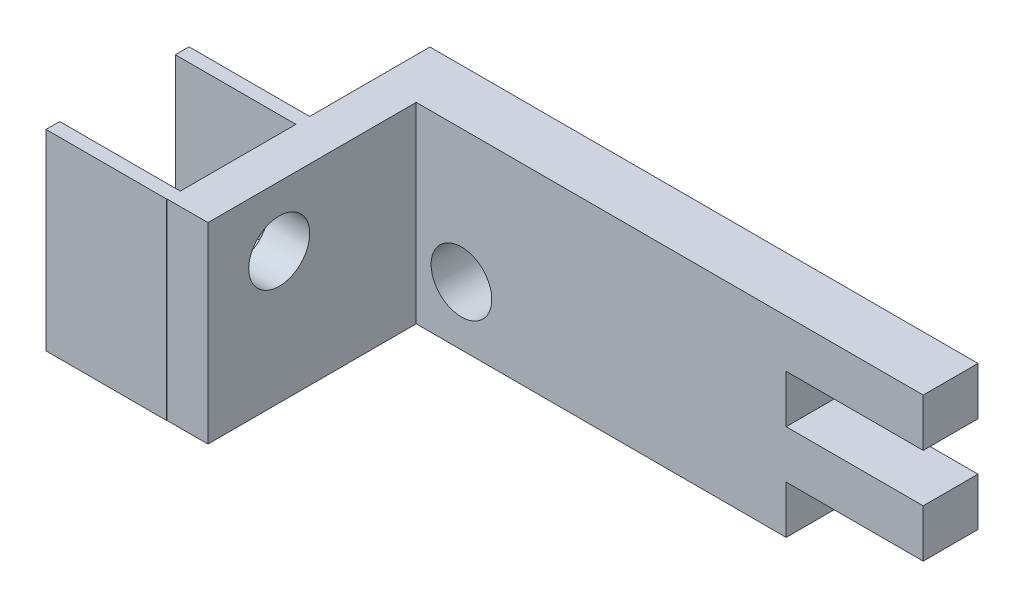
ISO-10303-21;
HEADER;
FILE_DESCRIPTION(('STEP AP214'),'2;1');
FILE_NAME('part.step','',(''),(''),'','','');
FILE_SCHEMA(('AUTOMOTIVE_DESIGN { 1 0 10303 214 1 1 1 1 }'));
ENDSEC;
DATA;
#1=APPLICATION_CONTEXT('core data for automotive mechanical design processes');
#2=APPLICATION_PROTOCOL_DEFINITION('international standard','automotive_design',2000,#1);
#3=PRODUCT_CONTEXT('',#1,'mechanical');
#4=PRODUCT('Part','Part','',(#3));
#5=PRODUCT_RELATED_PRODUCT_CATEGORY('part','',(#4));
#6=PRODUCT_DEFINITION_FORMATION('','',#4);
#7=PRODUCT_DEFINITION_CONTEXT('part definition',#1,'design');
#8=PRODUCT_DEFINITION('design','',#6,#7);
#9=PRODUCT_DEFINITION_SHAPE('','',#8);
#10=(LENGTH_UNIT() NAMED_UNIT(*) SI_UNIT(.MILLI.,.METRE.));
#11=(NAMED_UNIT(*) PLANE_ANGLE_UNIT() SI_UNIT($,.RADIAN.));
#12=(NAMED_UNIT(*) SI_UNIT($,.STERADIAN.) SOLID_ANGLE_UNIT());
#13=UNCERTAINTY_MEASURE_WITH_UNIT(LENGTH_MEASURE(1.E-05),#10,'distance_accuracy_value','');
#14=(GEOMETRIC_REPRESENTATION_CONTEXT(3) GLOBAL_UNCERTAINTY_ASSIGNED_CONTEXT((#13)) GLOBAL_UNIT_ASSIGNED_CONTEXT((#10,
#11,#12)) REPRESENTATION_CONTEXT('',''));
#15=CARTESIAN_POINT('',(0.,0.,0.));
#16=DIRECTION('',(0.,0.,1.));
#17=DIRECTION('',(1.,0.,0.));
#18=AXIS2_PLACEMENT_3D('',#15,#16,#17);
#19=CARTESIAN_POINT('',(-175.,70.,-45.));
#20=DIRECTION('',(1.,0.,0.));
#21=DIRECTION('',(0.,0.,-1.));
#22=AXIS2_PLACEMENT_3D('',#19,#20,#21);
#23=PLANE('',#22);
#24=DIRECTION('',(0.,-1.,0.));
#25=VECTOR('',#24,1.);
#26=CARTESIAN_POINT('',(-175.,0.,-1.10000000000001));
#27=LINE('',#26,#25);
#28=CARTESIAN_POINT('',(-175.,70.,-1.10000000000002));
#29=VERTEX_POINT('',#28);
#30=CARTESIAN_POINT('',(-175.,0.,-1.10000000000002));
#31=VERTEX_POINT('',#30);
#32=EDGE_CURVE('E225',#29,#31,#27,.T.);
#33=ORIENTED_EDGE('',*,*,#32,.F.);
#34=DIRECTION('',(0.,0.,1.));
#35=VECTOR('',#34,1.);
#36=CARTESIAN_POINT('',(-175.,70.,-45.));
#37=LINE('',#36,#35);
#38=CARTESIAN_POINT('',(-175.,70.,-45.));
#39=VERTEX_POINT('',#38);
#40=EDGE_CURVE('E353',#39,#29,#37,.T.);
#41=ORIENTED_EDGE('',*,*,#40,.F.);
#42=DIRECTION('',(0.,-1.,0.));
#43=VECTOR('',#42,1.);
#44=CARTESIAN_POINT('',(-175.,70.,-45.));
#45=LINE('',#44,#43);
#46=CARTESIAN_POINT('',(-175.,0.,-45.));
#47=VERTEX_POINT('',#46);
#48=EDGE_CURVE('E357',#39,#47,#45,.T.);
#49=ORIENTED_EDGE('',*,*,#48,.T.);
#50=DIRECTION('',(0.,0.,1.));
#51=VECTOR('',#50,1.);
#52=CARTESIAN_POINT('',(-175.,0.,-45.));
#53=LINE('',#52,#51);
#54=EDGE_CURVE('E352',#47,#31,#53,.T.);
#55=ORIENTED_EDGE('',*,*,#54,.T.);
#56=EDGE_LOOP('',(#33,#41,#49,#55));
#57=FACE_BOUND('',#56,.T.);
#58=ADVANCED_FACE('F61',(#57),#23,.F.);
#59=CARTESIAN_POINT('',(-175.,48.,25.));
#60=DIRECTION('',(-1.,0.,0.));
#61=DIRECTION('',(0.,0.,1.));
#62=AXIS2_PLACEMENT_3D('',#59,#60,#61);
#63=CIRCLE('',#62,11.125);
#64=CARTESIAN_POINT('',(-175.,48.,36.125));
#65=VERTEX_POINT('',#64);
#66=EDGE_CURVE('E325',#65,#65,#63,.T.);
#67=ORIENTED_EDGE('',*,*,#66,.F.);
#68=EDGE_LOOP('',(#67));
#69=FACE_BOUND('',#68,.T.);
#70=DIRECTION('',(0.,1.,0.));
#71=VECTOR('',#70,1.);
#72=CARTESIAN_POINT('',(-175.,70.,3.89999999999999));
#73=LINE('',#72,#71);
#74=CARTESIAN_POINT('',(-175.,26.75,3.89999999999999));
#75=VERTEX_POINT('',#74);
#76=CARTESIAN_POINT('',(-175.,70.,3.89999999999997));
#77=VERTEX_POINT('',#76);
#78=EDGE_CURVE('E232',#75,#77,#73,.T.);
#79=ORIENTED_EDGE('',*,*,#78,.F.);
#80=DIRECTION('',(0.,0.,-1.));
#81=VECTOR('',#80,1.);
#82=CARTESIAN_POINT('',(-175.,26.75,46.1));
#83=LINE('',#82,#81);
#84=CARTESIAN_POINT('',(-175.,26.75,46.1));
#85=VERTEX_POINT('',#84);
#86=EDGE_CURVE('E12',#85,#75,#83,.T.);
#87=ORIENTED_EDGE('',*,*,#86,.F.);
#88=DIRECTION('',(0.,-1.,0.));
#89=VECTOR('',#88,1.);
#90=CARTESIAN_POINT('',(-175.,70.,46.1));
#91=LINE('',#90,#89);
#92=CARTESIAN_POINT('',(-175.,70.,46.1));
#93=VERTEX_POINT('',#92);
#94=EDGE_CURVE('E435',#93,#85,#91,.T.);
#95=ORIENTED_EDGE('',*,*,#94,.F.);
#96=EDGE_CURVE('E86',#77,#93,#37,.T.);
#97=ORIENTED_EDGE('',*,*,#96,.F.);
#98=EDGE_LOOP('',(#79,#87,#95,#97));
#99=FACE_BOUND('',#98,.T.);
#100=ADVANCED_FACE('F474',(#69,#99),#23,.F.);
#101=CARTESIAN_POINT('',(-175.,70.,-45.));
#102=DIRECTION('',(0.,0.,1.));
#103=DIRECTION('',(1.,0.,0.));
#104=AXIS2_PLACEMENT_3D('',#101,#102,#103);
#105=PLANE('',#104);
#106=CARTESIAN_POINT('',(-143.5,21.5,-45.));
#107=DIRECTION('',(0.,0.,1.));
#108=DIRECTION('',(1.,0.,0.));
#109=AXIS2_PLACEMENT_3D('',#106,#107,#108);
#110=CIRCLE('',#109,11.075);
#111=CARTESIAN_POINT('',(-154.575,21.5,-45.));
#112=VERTEX_POINT('',#111);
#113=EDGE_CURVE('E299',#112,#112,#110,.T.);
#114=ORIENTED_EDGE('',*,*,#113,.T.);
#115=EDGE_LOOP('',(#114));
#116=FACE_BOUND('',#115,.T.);
#117=DIRECTION('',(1.,0.,0.));
#118=VECTOR('',#117,1.);
#119=CARTESIAN_POINT('',(0.,17.5,-45.));
#120=LINE('',#119,#118);
#121=CARTESIAN_POINT('',(-25.,17.5,-45.));
#122=VERTEX_POINT('',#121);
#123=CARTESIAN_POINT('',(25.,17.5,-45.));
#124=VERTEX_POINT('',#123);
#125=EDGE_CURVE('E279',#122,#124,#120,.T.);
#126=ORIENTED_EDGE('',*,*,#125,.F.);
#127=DIRECTION('',(0.,1.,0.));
#128=VECTOR('',#127,1.);
#129=CARTESIAN_POINT('',(-25.,0.,-45.));
#130=LINE('',#129,#128);
#131=CARTESIAN_POINT('',(-25.,0.,-45.));
#132=VERTEX_POINT('',#131);
#133=EDGE_CURVE('E275',#132,#122,#130,.T.);
#134=ORIENTED_EDGE('',*,*,#133,.F.);
#135=DIRECTION('',(-1.,0.,0.));
#136=VECTOR('',#135,1.);
#137=CARTESIAN_POINT('',(-175.,0.,-45.));
#138=LINE('',#137,#136);
#139=EDGE_CURVE('E348',#132,#47,#138,.T.);
#140=ORIENTED_EDGE('',*,*,#139,.T.);
#141=ORIENTED_EDGE('',*,*,#48,.F.);
#142=DIRECTION('',(-1.,0.,0.));
#143=VECTOR('',#142,1.);
#144=CARTESIAN_POINT('',(-175.,70.,-45.));
#145=LINE('',#144,#143);
#146=CARTESIAN_POINT('',(25.,70.,-45.));
#147=VERTEX_POINT('',#146);
#148=EDGE_CURVE('E349',#147,#39,#145,.T.);
#149=ORIENTED_EDGE('',*,*,#148,.F.);
#150=DIRECTION('',(0.,1.,0.));
#151=VECTOR('',#150,1.);
#152=CARTESIAN_POINT('',(25.,0.,-45.));
#153=LINE('',#152,#151);
#154=CARTESIAN_POINT('',(25.,52.5,-45.));
#155=VERTEX_POINT('',#154);
#156=EDGE_CURVE('E272',#155,#147,#153,.T.);
#157=ORIENTED_EDGE('',*,*,#156,.F.);
#158=DIRECTION('',(1.,0.,0.));
#159=VECTOR('',#158,1.);
#160=CARTESIAN_POINT('',(0.,52.5,-45.));
#161=LINE('',#160,#159);
#162=CARTESIAN_POINT('',(-25.,52.5,-45.));
#163=VERTEX_POINT('',#162);
#164=EDGE_CURVE('E268',#163,#155,#161,.T.);
#165=ORIENTED_EDGE('',*,*,#164,.F.);
#166=DIRECTION('',(0.,1.,0.));
#167=VECTOR('',#166,1.);
#168=CARTESIAN_POINT('',(-25.,0.,-45.));
#169=LINE('',#168,#167);
#170=CARTESIAN_POINT('',(-25.,35.,-45.));
#171=VERTEX_POINT('',#170);
#172=EDGE_CURVE('E291',#171,#163,#169,.T.);
#173=ORIENTED_EDGE('',*,*,#172,.F.);
#174=DIRECTION('',(-1.,0.,0.));
#175=VECTOR('',#174,1.);
#176=CARTESIAN_POINT('',(0.,35.,-45.));
#177=LINE('',#176,#175);
#178=CARTESIAN_POINT('',(25.,35.,-45.));
#179=VERTEX_POINT('',#178);
#180=EDGE_CURVE('E287',#179,#171,#177,.T.);
#181=ORIENTED_EDGE('',*,*,#180,.F.);
#182=DIRECTION('',(0.,1.,0.));
#183=VECTOR('',#182,1.);
#184=CARTESIAN_POINT('',(25.,0.,-45.));
#185=LINE('',#184,#183);
#186=EDGE_CURVE('E283',#124,#179,#185,.T.);
#187=ORIENTED_EDGE('',*,*,#186,.F.);
#188=EDGE_LOOP('',(#126,#134,#140,#141,#149,#157,#165,#173,#181,#187));
#189=FACE_BOUND('',#188,.T.);
#190=ADVANCED_FACE('F63',(#116,#189),#105,.F.);
#191=CARTESIAN_POINT('',(0.,70.,0.));
#192=DIRECTION('',(0.,1.,0.));
#193=DIRECTION('',(0.,0.,1.));
#194=AXIS2_PLACEMENT_3D('',#191,#192,#193);
#195=PLANE('',#194);
#196=DIRECTION('',(0.,0.,-1.));
#197=VECTOR('',#196,1.);
#198=CARTESIAN_POINT('',(25.,70.,45.));
#199=LINE('',#198,#197);
#200=CARTESIAN_POINT('',(25.,70.,-25.));
#201=VERTEX_POINT('',#200);
#202=EDGE_CURVE('E315',#201,#147,#199,.T.);
#203=ORIENTED_EDGE('',*,*,#202,.T.);
#204=ORIENTED_EDGE('',*,*,#148,.T.);
#205=ORIENTED_EDGE('',*,*,#40,.T.);
#206=DIRECTION('',(1.,0.,0.));
#207=VECTOR('',#206,1.);
#208=CARTESIAN_POINT('',(-219.,70.,-1.10000000000001));
#209=LINE('',#208,#207);
#210=CARTESIAN_POINT('',(-219.,70.,-1.10000000000001));
#211=VERTEX_POINT('',#210);
#212=EDGE_CURVE('E244',#211,#29,#209,.T.);
#213=ORIENTED_EDGE('',*,*,#212,.F.);
#214=DIRECTION('',(0.,0.,-1.));
#215=VECTOR('',#214,1.);
#216=CARTESIAN_POINT('',(-219.,70.,-1.10000000000001));
#217=LINE('',#216,#215);
#218=CARTESIAN_POINT('',(-219.,70.,3.89999999999999));
#219=VERTEX_POINT('',#218);
#220=EDGE_CURVE('E421',#219,#211,#217,.T.);
#221=ORIENTED_EDGE('',*,*,#220,.F.);
#222=DIRECTION('',(1.,0.,0.));
#223=VECTOR('',#222,1.);
#224=CARTESIAN_POINT('',(-219.,70.,3.89999999999999));
#225=LINE('',#224,#223);
#226=EDGE_CURVE('E248',#219,#77,#225,.T.);
#227=ORIENTED_EDGE('',*,*,#226,.T.);
#228=ORIENTED_EDGE('',*,*,#96,.T.);
#229=DIRECTION('',(1.,0.,0.));
#230=VECTOR('',#229,1.);
#231=CARTESIAN_POINT('',(-219.,70.,46.1));
#232=LINE('',#231,#230);
#233=CARTESIAN_POINT('',(-219.,70.,46.1));
#234=VERTEX_POINT('',#233);
#235=EDGE_CURVE('E260',#234,#93,#232,.T.);
#236=ORIENTED_EDGE('',*,*,#235,.F.);
#237=DIRECTION('',(0.,0.,-1.));
#238=VECTOR('',#237,1.);
#239=CARTESIAN_POINT('',(-219.,70.,51.1));
#240=LINE('',#239,#238);
#241=CARTESIAN_POINT('',(-219.,70.,51.1));
#242=VERTEX_POINT('',#241);
#243=EDGE_CURVE('E229',#242,#234,#240,.T.);
#244=ORIENTED_EDGE('',*,*,#243,.F.);
#245=DIRECTION('',(1.,0.,0.));
#246=VECTOR('',#245,1.);
#247=CARTESIAN_POINT('',(-219.,70.,51.1));
#248=LINE('',#247,#246);
#249=CARTESIAN_POINT('',(-175.,70.,51.1));
#250=VERTEX_POINT('',#249);
#251=EDGE_CURVE('E264',#242,#250,#248,.T.);
#252=ORIENTED_EDGE('',*,*,#251,.T.);
#253=DIRECTION('',(0.,0.,-1.));
#254=VECTOR('',#253,1.);
#255=CARTESIAN_POINT('',(-175.,70.,51.1));
#256=LINE('',#255,#254);
#257=CARTESIAN_POINT('',(-175.,70.,51.));
#258=VERTEX_POINT('',#257);
#259=EDGE_CURVE('E432',#250,#258,#256,.T.);
#260=ORIENTED_EDGE('',*,*,#259,.T.);
#261=DIRECTION('',(-1.,0.,0.));
#262=VECTOR('',#261,1.);
#263=CARTESIAN_POINT('',(-160.,70.,51.));
#264=LINE('',#263,#262);
#265=CARTESIAN_POINT('',(-160.,70.,51.));
#266=VERTEX_POINT('',#265);
#267=EDGE_CURVE('E78',#266,#258,#264,.T.);
#268=ORIENTED_EDGE('',*,*,#267,.F.);
#269=DIRECTION('',(0.,0.,1.));
#270=VECTOR('',#269,1.);
#271=CARTESIAN_POINT('',(-160.,70.,45.));
#272=LINE('',#271,#270);
#273=CARTESIAN_POINT('',(-160.,70.,-25.));
#274=VERTEX_POINT('',#273);
#275=EDGE_CURVE('E337',#274,#266,#272,.T.);
#276=ORIENTED_EDGE('',*,*,#275,.F.);
#277=DIRECTION('',(-1.,0.,0.));
#278=VECTOR('',#277,1.);
#279=CARTESIAN_POINT('',(-160.,70.,-25.));
#280=LINE('',#279,#278);
#281=EDGE_CURVE('E333',#201,#274,#280,.T.);
#282=ORIENTED_EDGE('',*,*,#281,.F.);
#283=EDGE_LOOP('',(#203,#204,#205,#213,#221,#227,#228,#236,#244,#252,#260,#268,#276,#282));
#284=FACE_BOUND('',#283,.T.);
#285=ADVANCED_FACE('F411',(#284),#195,.T.);
#286=CARTESIAN_POINT('',(0.,0.,0.));
#287=DIRECTION('',(0.,1.,0.));
#288=DIRECTION('',(0.,0.,1.));
#289=AXIS2_PLACEMENT_3D('',#286,#287,#288);
#290=PLANE('',#289);
#291=DIRECTION('',(0.,0.,1.));
#292=VECTOR('',#291,1.);
#293=CARTESIAN_POINT('',(-160.,0.,45.));
#294=LINE('',#293,#292);
#295=CARTESIAN_POINT('',(-160.,0.,-25.));
#296=VERTEX_POINT('',#295);
#297=CARTESIAN_POINT('',(-160.,0.,51.));
#298=VERTEX_POINT('',#297);
#299=EDGE_CURVE('E208',#296,#298,#294,.T.);
#300=ORIENTED_EDGE('',*,*,#299,.T.);
#301=DIRECTION('',(1.,0.,0.));
#302=VECTOR('',#301,1.);
#303=CARTESIAN_POINT('',(-175.,0.,51.));
#304=LINE('',#303,#302);
#305=CARTESIAN_POINT('',(-175.,0.,51.));
#306=VERTEX_POINT('',#305);
#307=EDGE_CURVE('E201',#306,#298,#304,.T.);
#308=ORIENTED_EDGE('',*,*,#307,.F.);
#309=DIRECTION('',(0.,0.,1.));
#310=VECTOR('',#309,1.);
#311=CARTESIAN_POINT('',(-175.,0.,51.1));
#312=LINE('',#311,#310);
#313=CARTESIAN_POINT('',(-175.,0.,51.1));
#314=VERTEX_POINT('',#313);
#315=EDGE_CURVE('E205',#306,#314,#312,.T.);
#316=ORIENTED_EDGE('',*,*,#315,.T.);
#317=DIRECTION('',(1.,0.,0.));
#318=VECTOR('',#317,1.);
#319=CARTESIAN_POINT('',(-219.,0.,51.1));
#320=LINE('',#319,#318);
#321=CARTESIAN_POINT('',(-219.,0.,51.1));
#322=VERTEX_POINT('',#321);
#323=EDGE_CURVE('E236',#322,#314,#320,.T.);
#324=ORIENTED_EDGE('',*,*,#323,.F.);
#325=DIRECTION('',(0.,0.,1.));
#326=VECTOR('',#325,1.);
#327=CARTESIAN_POINT('',(-219.,0.,51.1));
#328=LINE('',#327,#326);
#329=CARTESIAN_POINT('',(-219.,0.,-1.10000000000001));
#330=VERTEX_POINT('',#329);
#331=EDGE_CURVE('E240',#330,#322,#328,.T.);
#332=ORIENTED_EDGE('',*,*,#331,.F.);
#333=DIRECTION('',(1.,0.,0.));
#334=VECTOR('',#333,1.);
#335=CARTESIAN_POINT('',(-219.,0.,-1.10000000000001));
#336=LINE('',#335,#334);
#337=EDGE_CURVE('E239',#330,#31,#336,.T.);
#338=ORIENTED_EDGE('',*,*,#337,.T.);
#339=ORIENTED_EDGE('',*,*,#54,.F.);
#340=ORIENTED_EDGE('',*,*,#139,.F.);
#341=DIRECTION('',(0.,0.,-1.));
#342=VECTOR('',#341,1.);
#343=CARTESIAN_POINT('',(-25.,0.,45.));
#344=LINE('',#343,#342);
#345=CARTESIAN_POINT('',(-25.,0.,-25.));
#346=VERTEX_POINT('',#345);
#347=EDGE_CURVE('E312',#346,#132,#344,.T.);
#348=ORIENTED_EDGE('',*,*,#347,.F.);
#349=DIRECTION('',(-1.,0.,0.));
#350=VECTOR('',#349,1.);
#351=CARTESIAN_POINT('',(-160.,0.,-25.));
#352=LINE('',#351,#350);
#353=EDGE_CURVE('E334',#346,#296,#352,.T.);
#354=ORIENTED_EDGE('',*,*,#353,.T.);
#355=EDGE_LOOP('',(#300,#308,#316,#324,#332,#338,#339,#340,#348,#354));
#356=FACE_BOUND('',#355,.T.);
#357=ADVANCED_FACE('F202',(#356),#290,.F.);
#358=CARTESIAN_POINT('',(-160.,0.,45.));
#359=DIRECTION('',(-1.,0.,0.));
#360=DIRECTION('',(0.,0.,1.));
#361=AXIS2_PLACEMENT_3D('',#358,#359,#360);
#362=PLANE('',#361);
#363=CARTESIAN_POINT('',(-160.,48.,25.));
#364=DIRECTION('',(-1.,0.,0.));
#365=DIRECTION('',(0.,0.,1.));
#366=AXIS2_PLACEMENT_3D('',#363,#364,#365);
#367=CIRCLE('',#366,11.125);
#368=CARTESIAN_POINT('',(-160.,48.,36.125));
#369=VERTEX_POINT('',#368);
#370=EDGE_CURVE('E329',#369,#369,#367,.T.);
#371=ORIENTED_EDGE('',*,*,#370,.T.);
#372=EDGE_LOOP('',(#371));
#373=FACE_BOUND('',#372,.T.);
#374=ORIENTED_EDGE('',*,*,#275,.T.);
#375=DIRECTION('',(0.,1.,0.));
#376=VECTOR('',#375,1.);
#377=CARTESIAN_POINT('',(-160.,0.,51.));
#378=LINE('',#377,#376);
#379=EDGE_CURVE('E211',#298,#266,#378,.T.);
#380=ORIENTED_EDGE('',*,*,#379,.F.);
#381=ORIENTED_EDGE('',*,*,#299,.F.);
#382=DIRECTION('',(0.,1.,0.));
#383=VECTOR('',#382,1.);
#384=CARTESIAN_POINT('',(-160.,0.,-25.));
#385=LINE('',#384,#383);
#386=EDGE_CURVE('E340',#296,#274,#385,.T.);
#387=ORIENTED_EDGE('',*,*,#386,.T.);
#388=EDGE_LOOP('',(#374,#380,#381,#387));
#389=FACE_BOUND('',#388,.T.);
#390=ADVANCED_FACE('F488',(#373,#389),#362,.F.);
#391=CARTESIAN_POINT('',(-160.,0.,-25.));
#392=DIRECTION('',(0.,0.,-1.));
#393=DIRECTION('',(-1.,0.,0.));
#394=AXIS2_PLACEMENT_3D('',#391,#392,#393);
#395=PLANE('',#394);
#396=CARTESIAN_POINT('',(-143.5,21.5,-25.));
#397=DIRECTION('',(0.,0.,-1.));
#398=DIRECTION('',(-1.,0.,0.));
#399=AXIS2_PLACEMENT_3D('',#396,#397,#398);
#400=CIRCLE('',#399,11.075);
#401=CARTESIAN_POINT('',(-154.575,21.5,-25.));
#402=VERTEX_POINT('',#401);
#403=EDGE_CURVE('E324',#402,#402,#400,.F.);
#404=ORIENTED_EDGE('',*,*,#403,.F.);
#405=EDGE_LOOP('',(#404));
#406=FACE_BOUND('',#405,.T.);
#407=ORIENTED_EDGE('',*,*,#353,.F.);
#408=DIRECTION('',(0.,1.,0.));
#409=VECTOR('',#408,1.);
#410=CARTESIAN_POINT('',(-25.,0.,-25.));
#411=LINE('',#410,#409);
#412=CARTESIAN_POINT('',(-25.,17.5,-25.));
#413=VERTEX_POINT('',#412);
#414=EDGE_CURVE('E65',#346,#413,#411,.T.);
#415=ORIENTED_EDGE('',*,*,#414,.T.);
#416=DIRECTION('',(1.,0.,0.));
#417=VECTOR('',#416,1.);
#418=CARTESIAN_POINT('',(-160.,17.5,-25.));
#419=LINE('',#418,#417);
#420=CARTESIAN_POINT('',(25.,17.5,-25.));
#421=VERTEX_POINT('',#420);
#422=EDGE_CURVE('E387',#413,#421,#419,.T.);
#423=ORIENTED_EDGE('',*,*,#422,.T.);
#424=DIRECTION('',(0.,1.,0.));
#425=VECTOR('',#424,1.);
#426=CARTESIAN_POINT('',(25.,0.,-25.));
#427=LINE('',#426,#425);
#428=CARTESIAN_POINT('',(25.,35.,-25.));
#429=VERTEX_POINT('',#428);
#430=EDGE_CURVE('E384',#421,#429,#427,.T.);
#431=ORIENTED_EDGE('',*,*,#430,.T.);
#432=DIRECTION('',(-1.,0.,0.));
#433=VECTOR('',#432,1.);
#434=CARTESIAN_POINT('',(-160.,35.,-25.));
#435=LINE('',#434,#433);
#436=CARTESIAN_POINT('',(-25.,35.,-25.));
#437=VERTEX_POINT('',#436);
#438=EDGE_CURVE('E380',#429,#437,#435,.T.);
#439=ORIENTED_EDGE('',*,*,#438,.T.);
#440=DIRECTION('',(0.,1.,0.));
#441=VECTOR('',#440,1.);
#442=CARTESIAN_POINT('',(-25.,0.,-25.));
#443=LINE('',#442,#441);
#444=CARTESIAN_POINT('',(-25.,52.5,-25.));
#445=VERTEX_POINT('',#444);
#446=EDGE_CURVE('E376',#437,#445,#443,.T.);
#447=ORIENTED_EDGE('',*,*,#446,.T.);
#448=DIRECTION('',(1.,0.,0.));
#449=VECTOR('',#448,1.);
#450=CARTESIAN_POINT('',(-160.,52.5000000000001,-25.));
#451=LINE('',#450,#449);
#452=CARTESIAN_POINT('',(25.,52.5,-25.));
#453=VERTEX_POINT('',#452);
#454=EDGE_CURVE('E372',#445,#453,#451,.T.);
#455=ORIENTED_EDGE('',*,*,#454,.T.);
#456=DIRECTION('',(0.,1.,0.));
#457=VECTOR('',#456,1.);
#458=CARTESIAN_POINT('',(25.,0.,-25.));
#459=LINE('',#458,#457);
#460=EDGE_CURVE('E365',#453,#201,#459,.T.);
#461=ORIENTED_EDGE('',*,*,#460,.T.);
#462=ORIENTED_EDGE('',*,*,#281,.T.);
#463=ORIENTED_EDGE('',*,*,#386,.F.);
#464=EDGE_LOOP('',(#407,#415,#423,#431,#439,#447,#455,#461,#462,#463));
#465=FACE_BOUND('',#464,.T.);
#466=ADVANCED_FACE('F394',(#406,#465),#395,.F.);
#467=CARTESIAN_POINT('',(175.,48.,25.));
#468=DIRECTION('',(-1.,0.,0.));
#469=DIRECTION('',(0.,0.,1.));
#470=AXIS2_PLACEMENT_3D('',#467,#468,#469);
#471=CYLINDRICAL_SURFACE('',#470,11.125);
#472=ORIENTED_EDGE('',*,*,#66,.T.);
#473=EDGE_LOOP('',(#472));
#474=FACE_BOUND('',#473,.T.);
#475=ORIENTED_EDGE('',*,*,#370,.F.);
#476=EDGE_LOOP('',(#475));
#477=FACE_BOUND('',#476,.T.);
#478=ADVANCED_FACE('F492',(#474,#477),#471,.F.);
#479=CARTESIAN_POINT('',(-143.5,21.5,45.));
#480=DIRECTION('',(0.,0.,-1.));
#481=DIRECTION('',(-1.,0.,0.));
#482=AXIS2_PLACEMENT_3D('',#479,#480,#481);
#483=CYLINDRICAL_SURFACE('',#482,11.075);
#484=CARTESIAN_POINT('',(-154.575,21.5,-45.));
#485=CARTESIAN_POINT('',(-154.575,21.5,-44.7916666666667));
#486=CARTESIAN_POINT('',(-154.575,21.5,-44.5833333333333));
#487=CARTESIAN_POINT('',(-154.575,21.5,-44.1666666666667));
#488=CARTESIAN_POINT('',(-154.575,21.5,-43.9583333333333));
#489=CARTESIAN_POINT('',(-154.575,21.5,-43.5416666666667));
#490=CARTESIAN_POINT('',(-154.575,21.5,-43.3333333333333));
#491=CARTESIAN_POINT('',(-154.575,21.5,-42.9166666666667));
#492=CARTESIAN_POINT('',(-154.575,21.5,-42.7083333333333));
#493=CARTESIAN_POINT('',(-154.575,21.5,-42.2916666666667));
#494=CARTESIAN_POINT('',(-154.575,21.5,-42.0833333333333));
#495=CARTESIAN_POINT('',(-154.575,21.5,-41.6666666666667));
#496=CARTESIAN_POINT('',(-154.575,21.5,-41.4583333333333));
#497=CARTESIAN_POINT('',(-154.575,21.5,-41.0416666666667));
#498=CARTESIAN_POINT('',(-154.575,21.5,-40.8333333333333));
#499=CARTESIAN_POINT('',(-154.575,21.5,-40.4166666666667));
#500=CARTESIAN_POINT('',(-154.575,21.5,-40.2083333333333));
#501=CARTESIAN_POINT('',(-154.575,21.5,-39.7916666666667));
#502=CARTESIAN_POINT('',(-154.575,21.5,-39.5833333333333));
#503=CARTESIAN_POINT('',(-154.575,21.5,-39.1666666666667));
#504=CARTESIAN_POINT('',(-154.575,21.5,-38.9583333333333));
#505=CARTESIAN_POINT('',(-154.575,21.5,-38.5416666666667));
#506=CARTESIAN_POINT('',(-154.575,21.5,-38.3333333333333));
#507=CARTESIAN_POINT('',(-154.575,21.5,-37.9166666666667));
#508=CARTESIAN_POINT('',(-154.575,21.5,-37.7083333333333));
#509=CARTESIAN_POINT('',(-154.575,21.5,-37.2916666666667));
#510=CARTESIAN_POINT('',(-154.575,21.5,-37.0833333333333));
#511=CARTESIAN_POINT('',(-154.575,21.5,-36.6666666666667));
#512=CARTESIAN_POINT('',(-154.575,21.5,-36.4583333333333));
#513=CARTESIAN_POINT('',(-154.575,21.5,-36.0416666666667));
#514=CARTESIAN_POINT('',(-154.575,21.5,-35.8333333333333));
#515=CARTESIAN_POINT('',(-154.575,21.5,-35.4166666666667));
#516=CARTESIAN_POINT('',(-154.575,21.5,-35.2083333333333));
#517=CARTESIAN_POINT('',(-154.575,21.5,-34.7916666666667));
#518=CARTESIAN_POINT('',(-154.575,21.5,-34.5833333333333));
#519=CARTESIAN_POINT('',(-154.575,21.5,-34.1666666666667));
#520=CARTESIAN_POINT('',(-154.575,21.5,-33.9583333333333));
#521=CARTESIAN_POINT('',(-154.575,21.5,-33.5416666666667));
#522=CARTESIAN_POINT('',(-154.575,21.5,-33.3333333333333));
#523=CARTESIAN_POINT('',(-154.575,21.5,-32.9166666666667));
#524=CARTESIAN_POINT('',(-154.575,21.5,-32.7083333333333));
#525=CARTESIAN_POINT('',(-154.575,21.5,-32.2916666666667));
#526=CARTESIAN_POINT('',(-154.575,21.5,-32.0833333333333));
#527=CARTESIAN_POINT('',(-154.575,21.5,-31.6666666666667));
#528=CARTESIAN_POINT('',(-154.575,21.5,-31.4583333333333));
#529=CARTESIAN_POINT('',(-154.575,21.5,-31.0416666666667));
#530=CARTESIAN_POINT('',(-154.575,21.5,-30.8333333333333));
#531=CARTESIAN_POINT('',(-154.575,21.5,-30.4166666666667));
#532=CARTESIAN_POINT('',(-154.575,21.5,-30.2083333333333));
#533=CARTESIAN_POINT('',(-154.575,21.5,-29.7916666666667));
#534=CARTESIAN_POINT('',(-154.575,21.5,-29.5833333333333));
#535=CARTESIAN_POINT('',(-154.575,21.5,-29.1666666666667));
#536=CARTESIAN_POINT('',(-154.575,21.5,-28.9583333333333));
#537=CARTESIAN_POINT('',(-154.575,21.5,-28.5416666666667));
#538=CARTESIAN_POINT('',(-154.575,21.5,-28.3333333333333));
#539=CARTESIAN_POINT('',(-154.575,21.5,-27.9166666666667));
#540=CARTESIAN_POINT('',(-154.575,21.5,-27.7083333333333));
#541=CARTESIAN_POINT('',(-154.575,21.5,-27.2916666666667));
#542=CARTESIAN_POINT('',(-154.575,21.5,-27.0833333333333));
#543=CARTESIAN_POINT('',(-154.575,21.5,-26.6666666666667));
#544=CARTESIAN_POINT('',(-154.575,21.5,-26.4583333333333));
#545=CARTESIAN_POINT('',(-154.575,21.5,-26.0416666666667));
#546=CARTESIAN_POINT('',(-154.575,21.5,-25.8333333333333));
#547=CARTESIAN_POINT('',(-154.575,21.5,-25.4166666666667));
#548=CARTESIAN_POINT('',(-154.575,21.5,-25.2083333333333));
#549=CARTESIAN_POINT('',(-154.575,21.5,-25.));
#550=B_SPLINE_CURVE_WITH_KNOTS('',3,(#484,#485,#486,#487,#488,#489,#490,#491,#492,#493,#494,
#495,#496,#497,#498,#499,#500,#501,#502,#503,#504,#505,#506,#507,#508,#509,#510,#511,#512,#513,
#514,#515,#516,#517,#518,#519,#520,#521,#522,#523,#524,#525,#526,#527,#528,#529,#530,#531,#532,
#533,#534,#535,#536,#537,#538,#539,#540,#541,#542,#543,#544,#545,#546,#547,#548,#549),
.UNSPECIFIED.,.F.,.F.,(4,2,2,2,2,2,2,2,2,2,2,2,2,2,2,2,2,2,2,2,2,2,2,2,2,2,2,2,2,2,2,2,4),(0.,
0.625000000000001,1.25,1.875,2.5,3.125,3.75,4.375,5.,5.62500000000001,6.25000000000001,
6.87500000000001,7.50000000000001,8.12500000000001,8.75000000000001,9.37500000000001,10.,10.625,
11.25,11.875,12.5,13.125,13.75,14.375,15.,15.625,16.25,16.875,17.5,18.125,18.75,19.375,20.),.UNSPECIFIED.);
#551=EDGE_CURVE('BSEAM499',#112,#402,#550,.T.);
#552=ORIENTED_EDGE('',*,*,#113,.F.);
#553=ORIENTED_EDGE('',*,*,#403,.T.);
#554=ORIENTED_EDGE('',*,*,#551,.T.);
#555=ORIENTED_EDGE('',*,*,#551,.F.);
#556=EDGE_LOOP('',(#552,#554,#553,#555));
#557=FACE_BOUND('',#556,.T.);
#558=ADVANCED_FACE('F499',(#557),#483,.F.);
#559=CARTESIAN_POINT('',(0.,52.5,45.));
#560=DIRECTION('',(0.,1.,0.));
#561=DIRECTION('',(-1.,0.,0.));
#562=AXIS2_PLACEMENT_3D('',#559,#560,#561);
#563=PLANE('',#562);
#564=DIRECTION('',(0.,0.,-1.));
#565=VECTOR('',#564,1.);
#566=CARTESIAN_POINT('',(-25.,52.5,45.));
#567=LINE('',#566,#565);
#568=EDGE_CURVE('E296',#445,#163,#567,.T.);
#569=ORIENTED_EDGE('',*,*,#568,.T.);
#570=ORIENTED_EDGE('',*,*,#164,.T.);
#571=DIRECTION('',(0.,0.,-1.));
#572=VECTOR('',#571,1.);
#573=CARTESIAN_POINT('',(25.,52.5,45.));
#574=LINE('',#573,#572);
#575=EDGE_CURVE('E295',#453,#155,#574,.T.);
#576=ORIENTED_EDGE('',*,*,#575,.F.);
#577=ORIENTED_EDGE('',*,*,#454,.F.);
#578=EDGE_LOOP('',(#569,#570,#576,#577));
#579=FACE_BOUND('',#578,.T.);
#580=ADVANCED_FACE('F503',(#579),#563,.F.);
#581=CARTESIAN_POINT('',(-25.,0.,45.));
#582=DIRECTION('',(-1.,0.,0.));
#583=DIRECTION('',(0.,0.,1.));
#584=AXIS2_PLACEMENT_3D('',#581,#582,#583);
#585=PLANE('',#584);
#586=DIRECTION('',(0.,0.,-1.));
#587=VECTOR('',#586,1.);
#588=CARTESIAN_POINT('',(-25.,35.,45.));
#589=LINE('',#588,#587);
#590=EDGE_CURVE('E300',#437,#171,#589,.T.);
#591=ORIENTED_EDGE('',*,*,#590,.T.);
#592=ORIENTED_EDGE('',*,*,#172,.T.);
#593=ORIENTED_EDGE('',*,*,#568,.F.);
#594=ORIENTED_EDGE('',*,*,#446,.F.);
#595=EDGE_LOOP('',(#591,#592,#593,#594));
#596=FACE_BOUND('',#595,.T.);
#597=ADVANCED_FACE('F507',(#596),#585,.F.);
#598=CARTESIAN_POINT('',(0.,35.,45.));
#599=DIRECTION('',(0.,-1.,0.));
#600=DIRECTION('',(0.,0.,-1.));
#601=AXIS2_PLACEMENT_3D('',#598,#599,#600);
#602=PLANE('',#601);
#603=DIRECTION('',(0.,0.,-1.));
#604=VECTOR('',#603,1.);
#605=CARTESIAN_POINT('',(25.,35.,45.));
#606=LINE('',#605,#604);
#607=EDGE_CURVE('E303',#429,#179,#606,.T.);
#608=ORIENTED_EDGE('',*,*,#607,.T.);
#609=ORIENTED_EDGE('',*,*,#180,.T.);
#610=ORIENTED_EDGE('',*,*,#590,.F.);
#611=ORIENTED_EDGE('',*,*,#438,.F.);
#612=EDGE_LOOP('',(#608,#609,#610,#611));
#613=FACE_BOUND('',#612,.T.);
#614=ADVANCED_FACE('F522',(#613),#602,.F.);
#615=CARTESIAN_POINT('',(25.,0.,45.));
#616=DIRECTION('',(-1.,0.,0.));
#617=DIRECTION('',(0.,0.,1.));
#618=AXIS2_PLACEMENT_3D('',#615,#616,#617);
#619=PLANE('',#618);
#620=DIRECTION('',(0.,0.,-1.));
#621=VECTOR('',#620,1.);
#622=CARTESIAN_POINT('',(25.,17.5,45.));
#623=LINE('',#622,#621);
#624=EDGE_CURVE('E306',#421,#124,#623,.T.);
#625=ORIENTED_EDGE('',*,*,#624,.T.);
#626=ORIENTED_EDGE('',*,*,#186,.T.);
#627=ORIENTED_EDGE('',*,*,#607,.F.);
#628=ORIENTED_EDGE('',*,*,#430,.F.);
#629=EDGE_LOOP('',(#625,#626,#627,#628));
#630=FACE_BOUND('',#629,.T.);
#631=ADVANCED_FACE('F518',(#630),#619,.F.);
#632=CARTESIAN_POINT('',(0.,17.5,45.));
#633=DIRECTION('',(0.,1.,0.));
#634=DIRECTION('',(-1.,0.,0.));
#635=AXIS2_PLACEMENT_3D('',#632,#633,#634);
#636=PLANE('',#635);
#637=DIRECTION('',(0.,0.,-1.));
#638=VECTOR('',#637,1.);
#639=CARTESIAN_POINT('',(-25.,17.5,45.));
#640=LINE('',#639,#638);
#641=EDGE_CURVE('E309',#413,#122,#640,.T.);
#642=ORIENTED_EDGE('',*,*,#641,.T.);
#643=ORIENTED_EDGE('',*,*,#125,.T.);
#644=ORIENTED_EDGE('',*,*,#624,.F.);
#645=ORIENTED_EDGE('',*,*,#422,.F.);
#646=EDGE_LOOP('',(#642,#643,#644,#645));
#647=FACE_BOUND('',#646,.T.);
#648=ADVANCED_FACE('F515',(#647),#636,.F.);
#649=CARTESIAN_POINT('',(-25.,0.,45.));
#650=DIRECTION('',(-1.,0.,0.));
#651=DIRECTION('',(0.,0.,1.));
#652=AXIS2_PLACEMENT_3D('',#649,#650,#651);
#653=PLANE('',#652);
#654=ORIENTED_EDGE('',*,*,#347,.T.);
#655=ORIENTED_EDGE('',*,*,#133,.T.);
#656=ORIENTED_EDGE('',*,*,#641,.F.);
#657=ORIENTED_EDGE('',*,*,#414,.F.);
#658=EDGE_LOOP('',(#654,#655,#656,#657));
#659=FACE_BOUND('',#658,.T.);
#660=ADVANCED_FACE('F399',(#659),#653,.F.);
#661=CARTESIAN_POINT('',(25.,0.,45.));
#662=DIRECTION('',(-1.,0.,0.));
#663=DIRECTION('',(0.,0.,1.));
#664=AXIS2_PLACEMENT_3D('',#661,#662,#663);
#665=PLANE('',#664);
#666=ORIENTED_EDGE('',*,*,#575,.T.);
#667=ORIENTED_EDGE('',*,*,#156,.T.);
#668=ORIENTED_EDGE('',*,*,#202,.F.);
#669=ORIENTED_EDGE('',*,*,#460,.F.);
#670=EDGE_LOOP('',(#666,#667,#668,#669));
#671=FACE_BOUND('',#670,.T.);
#672=ADVANCED_FACE('F509',(#671),#665,.F.);
#673=CARTESIAN_POINT('',(-219.,45.4427408981725,51.1));
#674=DIRECTION('',(0.,0.,-1.));
#675=DIRECTION('',(-1.,0.,0.));
#676=AXIS2_PLACEMENT_3D('',#673,#674,#675);
#677=PLANE('',#676);
#678=DIRECTION('',(0.,1.,0.));
#679=VECTOR('',#678,1.);
#680=CARTESIAN_POINT('',(-175.,45.4427408981725,51.1));
#681=LINE('',#680,#679);
#682=EDGE_CURVE('E221',#314,#250,#681,.T.);
#683=ORIENTED_EDGE('',*,*,#682,.T.);
#684=ORIENTED_EDGE('',*,*,#251,.F.);
#685=DIRECTION('',(0.,1.,0.));
#686=VECTOR('',#685,1.);
#687=CARTESIAN_POINT('',(-219.,0.,51.1));
#688=LINE('',#687,#686);
#689=EDGE_CURVE('E224',#322,#242,#688,.T.);
#690=ORIENTED_EDGE('',*,*,#689,.F.);
#691=ORIENTED_EDGE('',*,*,#323,.T.);
#692=EDGE_LOOP('',(#683,#684,#690,#691));
#693=FACE_BOUND('',#692,.T.);
#694=ADVANCED_FACE('F467',(#693),#677,.F.);
#695=CARTESIAN_POINT('',(-219.,70.,46.1));
#696=DIRECTION('',(0.,0.,1.));
#697=DIRECTION('',(0.,-1.,0.));
#698=AXIS2_PLACEMENT_3D('',#695,#696,#697);
#699=PLANE('',#698);
#700=ORIENTED_EDGE('',*,*,#94,.T.);
#701=DIRECTION('',(1.,0.,0.));
#702=VECTOR('',#701,1.);
#703=CARTESIAN_POINT('',(-219.,26.75,46.1));
#704=LINE('',#703,#702);
#705=CARTESIAN_POINT('',(-219.,26.75,46.1));
#706=VERTEX_POINT('',#705);
#707=EDGE_CURVE('E256',#706,#85,#704,.T.);
#708=ORIENTED_EDGE('',*,*,#707,.F.);
#709=DIRECTION('',(0.,-1.,0.));
#710=VECTOR('',#709,1.);
#711=CARTESIAN_POINT('',(-219.,70.,46.1));
#712=LINE('',#711,#710);
#713=EDGE_CURVE('E450',#234,#706,#712,.T.);
#714=ORIENTED_EDGE('',*,*,#713,.F.);
#715=ORIENTED_EDGE('',*,*,#235,.T.);
#716=EDGE_LOOP('',(#700,#708,#714,#715));
#717=FACE_BOUND('',#716,.T.);
#718=ADVANCED_FACE('F471',(#717),#699,.F.);
#719=CARTESIAN_POINT('',(-219.,26.75,46.1));
#720=DIRECTION('',(0.,-1.,0.));
#721=DIRECTION('',(0.,0.,-1.));
#722=AXIS2_PLACEMENT_3D('',#719,#720,#721);
#723=PLANE('',#722);
#724=ORIENTED_EDGE('',*,*,#707,.T.);
#725=ORIENTED_EDGE('',*,*,#86,.T.);
#726=DIRECTION('',(1.,0.,0.));
#727=VECTOR('',#726,1.);
#728=CARTESIAN_POINT('',(-219.,26.75,3.89999999999999));
#729=LINE('',#728,#727);
#730=CARTESIAN_POINT('',(-219.,26.75,3.89999999999999));
#731=VERTEX_POINT('',#730);
#732=EDGE_CURVE('E252',#731,#75,#729,.T.);
#733=ORIENTED_EDGE('',*,*,#732,.F.);
#734=DIRECTION('',(0.,0.,-1.));
#735=VECTOR('',#734,1.);
#736=CARTESIAN_POINT('',(-219.,26.75,46.1));
#737=LINE('',#736,#735);
#738=EDGE_CURVE('E447',#706,#731,#737,.T.);
#739=ORIENTED_EDGE('',*,*,#738,.F.);
#740=EDGE_LOOP('',(#724,#725,#733,#739));
#741=FACE_BOUND('',#740,.T.);
#742=ADVANCED_FACE('F473',(#741),#723,.F.);
#743=CARTESIAN_POINT('',(-219.,70.,3.89999999999999));
#744=DIRECTION('',(0.,0.,-1.));
#745=DIRECTION('',(0.,1.,0.));
#746=AXIS2_PLACEMENT_3D('',#743,#744,#745);
#747=PLANE('',#746);
#748=ORIENTED_EDGE('',*,*,#78,.T.);
#749=ORIENTED_EDGE('',*,*,#226,.F.);
#750=DIRECTION('',(0.,1.,0.));
#751=VECTOR('',#750,1.);
#752=CARTESIAN_POINT('',(-219.,70.,3.89999999999999));
#753=LINE('',#752,#751);
#754=EDGE_CURVE('E426',#731,#219,#753,.T.);
#755=ORIENTED_EDGE('',*,*,#754,.F.);
#756=ORIENTED_EDGE('',*,*,#732,.T.);
#757=EDGE_LOOP('',(#748,#749,#755,#756));
#758=FACE_BOUND('',#757,.T.);
#759=ADVANCED_FACE('F441',(#758),#747,.F.);
#760=CARTESIAN_POINT('',(-219.,0.,-1.10000000000001));
#761=DIRECTION('',(0.,0.,1.));
#762=DIRECTION('',(1.,0.,0.));
#763=AXIS2_PLACEMENT_3D('',#760,#761,#762);
#764=PLANE('',#763);
#765=ORIENTED_EDGE('',*,*,#32,.T.);
#766=ORIENTED_EDGE('',*,*,#337,.F.);
#767=DIRECTION('',(0.,-1.,0.));
#768=VECTOR('',#767,1.);
#769=CARTESIAN_POINT('',(-219.,19.9387611529136,-1.10000000000001));
#770=LINE('',#769,#768);
#771=EDGE_CURVE('E417',#211,#330,#770,.T.);
#772=ORIENTED_EDGE('',*,*,#771,.F.);
#773=ORIENTED_EDGE('',*,*,#212,.T.);
#774=EDGE_LOOP('',(#765,#766,#772,#773));
#775=FACE_BOUND('',#774,.T.);
#776=ADVANCED_FACE('F415',(#775),#764,.F.);
#777=CARTESIAN_POINT('',(-219.,0.,0.));
#778=DIRECTION('',(-1.,0.,0.));
#779=DIRECTION('',(0.,0.,1.));
#780=AXIS2_PLACEMENT_3D('',#777,#778,#779);
#781=PLANE('',#780);
#782=ORIENTED_EDGE('',*,*,#689,.T.);
#783=ORIENTED_EDGE('',*,*,#243,.T.);
#784=ORIENTED_EDGE('',*,*,#713,.T.);
#785=ORIENTED_EDGE('',*,*,#738,.T.);
#786=ORIENTED_EDGE('',*,*,#754,.T.);
#787=ORIENTED_EDGE('',*,*,#220,.T.);
#788=ORIENTED_EDGE('',*,*,#771,.T.);
#789=ORIENTED_EDGE('',*,*,#331,.T.);
#790=EDGE_LOOP('',(#782,#783,#784,#785,#786,#787,#788,#789));
#791=FACE_BOUND('',#790,.T.);
#792=ADVANCED_FACE('F445',(#791),#781,.T.);
#793=CARTESIAN_POINT('',(-175.,0.,0.));
#794=DIRECTION('',(-1.,0.,0.));
#795=DIRECTION('',(0.,0.,1.));
#796=AXIS2_PLACEMENT_3D('',#793,#794,#795);
#797=PLANE('',#796);
#798=ORIENTED_EDGE('',*,*,#315,.F.);
#799=DIRECTION('',(0.,-1.,0.));
#800=VECTOR('',#799,1.);
#801=CARTESIAN_POINT('',(-175.,26.75,51.));
#802=LINE('',#801,#800);
#803=EDGE_CURVE('E212',#258,#306,#802,.T.);
#804=ORIENTED_EDGE('',*,*,#803,.F.);
#805=ORIENTED_EDGE('',*,*,#259,.F.);
#806=ORIENTED_EDGE('',*,*,#682,.F.);
#807=EDGE_LOOP('',(#798,#804,#805,#806));
#808=FACE_BOUND('',#807,.T.);
#809=ADVANCED_FACE('F220',(#808),#797,.F.);
#810=CARTESIAN_POINT('',(0.,0.,51.));
#811=DIRECTION('',(0.,0.,1.));
#812=DIRECTION('',(1.,0.,0.));
#813=AXIS2_PLACEMENT_3D('',#810,#811,#812);
#814=PLANE('',#813);
#815=ORIENTED_EDGE('',*,*,#803,.T.);
#816=ORIENTED_EDGE('',*,*,#307,.T.);
#817=ORIENTED_EDGE('',*,*,#379,.T.);
#818=ORIENTED_EDGE('',*,*,#267,.T.);
#819=EDGE_LOOP('',(#815,#816,#817,#818));
#820=FACE_BOUND('',#819,.T.);
#821=ADVANCED_FACE('F214',(#820),#814,.T.);
#822=CLOSED_SHELL('',(#58,#100,#190,#285,#357,#390,#466,#478,#558,#580,#597,#614,#631,#648,#660,
#672,#694,#718,#742,#759,#776,#792,#809,#821));
#823=MANIFOLD_SOLID_BREP('B2',#822);
#824=ADVANCED_BREP_SHAPE_REPRESENTATION('',(#18,#823),#14);
#825=SHAPE_DEFINITION_REPRESENTATION(#9,#824);
ENDSEC;
END-ISO-10303-21;
